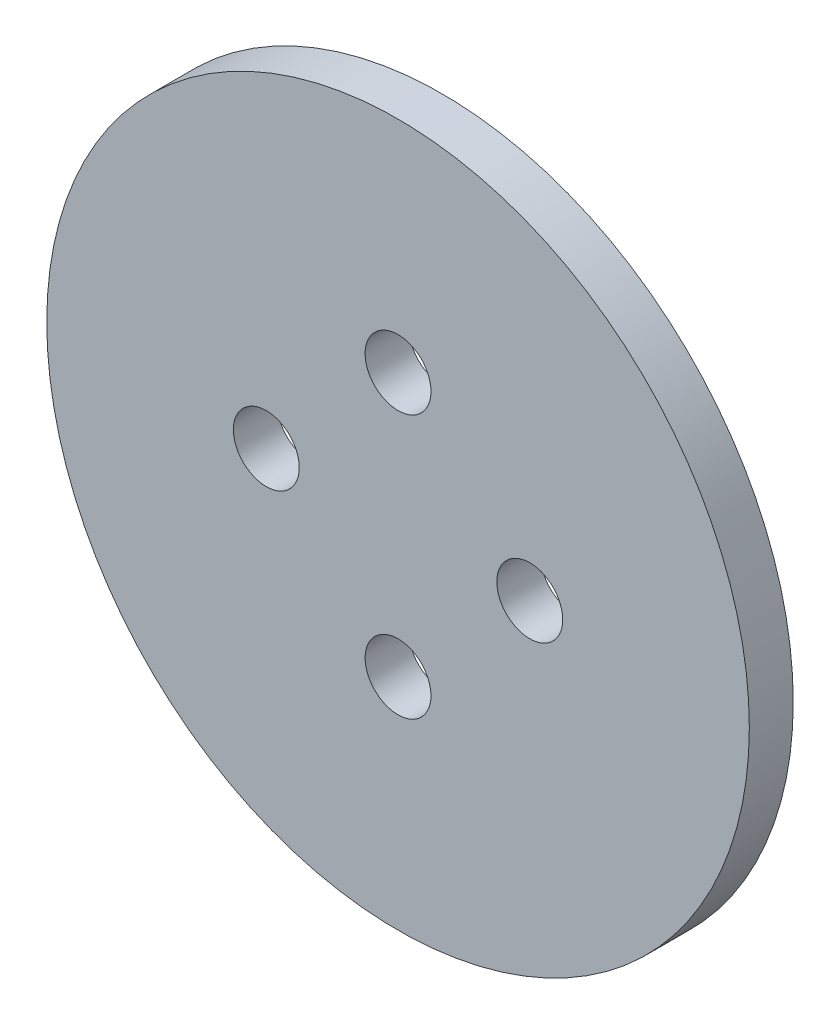
ISO-10303-21;
HEADER;
FILE_DESCRIPTION(('STEP AP214'),'2;1');
FILE_NAME('part.step','',(''),(''),'','','');
FILE_SCHEMA(('AUTOMOTIVE_DESIGN { 1 0 10303 214 1 1 1 1 }'));
ENDSEC;
DATA;
#1=APPLICATION_CONTEXT('core data for automotive mechanical design processes');
#2=APPLICATION_PROTOCOL_DEFINITION('international standard','automotive_design',2000,#1);
#3=PRODUCT_CONTEXT('',#1,'mechanical');
#4=PRODUCT('Part','Part','',(#3));
#5=PRODUCT_RELATED_PRODUCT_CATEGORY('part','',(#4));
#6=PRODUCT_DEFINITION_FORMATION('','',#4);
#7=PRODUCT_DEFINITION_CONTEXT('part definition',#1,'design');
#8=PRODUCT_DEFINITION('design','',#6,#7);
#9=PRODUCT_DEFINITION_SHAPE('','',#8);
#10=(LENGTH_UNIT() NAMED_UNIT(*) SI_UNIT(.MILLI.,.METRE.));
#11=(NAMED_UNIT(*) PLANE_ANGLE_UNIT() SI_UNIT($,.RADIAN.));
#12=(NAMED_UNIT(*) SI_UNIT($,.STERADIAN.) SOLID_ANGLE_UNIT());
#13=UNCERTAINTY_MEASURE_WITH_UNIT(LENGTH_MEASURE(1.E-05),#10,'distance_accuracy_value','');
#14=(GEOMETRIC_REPRESENTATION_CONTEXT(3) GLOBAL_UNCERTAINTY_ASSIGNED_CONTEXT((#13)) GLOBAL_UNIT_ASSIGNED_CONTEXT((#10,
#11,#12)) REPRESENTATION_CONTEXT('',''));
#15=CARTESIAN_POINT('',(0.,0.,0.));
#16=DIRECTION('',(0.,0.,1.));
#17=DIRECTION('',(1.,0.,0.));
#18=AXIS2_PLACEMENT_3D('',#15,#16,#17);
#19=CARTESIAN_POINT('',(0.,0.,3.175));
#20=DIRECTION('',(0.,0.,1.));
#21=DIRECTION('',(1.,0.,0.));
#22=AXIS2_PLACEMENT_3D('',#19,#20,#21);
#23=PLANE('',#22);
#24=CARTESIAN_POINT('',(5.39100612496821E-13,-9.525,3.175));
#25=DIRECTION('',(0.,0.,1.));
#26=DIRECTION('',(1.,0.,0.));
#27=AXIS2_PLACEMENT_3D('',#24,#25,#26);
#28=CIRCLE('',#27,2.38125000000058);
#29=CARTESIAN_POINT('',(2.38125000000112,-9.525,3.175));
#30=VERTEX_POINT('',#29);
#31=EDGE_CURVE('E53',#30,#30,#28,.T.);
#32=ORIENTED_EDGE('',*,*,#31,.F.);
#33=EDGE_LOOP('',(#32));
#34=FACE_BOUND('',#33,.T.);
#35=CARTESIAN_POINT('',(0.,9.525,3.175));
#36=DIRECTION('',(0.,0.,1.));
#37=DIRECTION('',(1.,0.,0.));
#38=AXIS2_PLACEMENT_3D('',#35,#36,#37);
#39=CIRCLE('',#38,2.38125);
#40=CARTESIAN_POINT('',(2.38125,9.525,3.175));
#41=VERTEX_POINT('',#40);
#42=EDGE_CURVE('E42',#41,#41,#39,.T.);
#43=ORIENTED_EDGE('',*,*,#42,.F.);
#44=EDGE_LOOP('',(#43));
#45=FACE_BOUND('',#44,.T.);
#46=CARTESIAN_POINT('',(0.,0.,3.175));
#47=DIRECTION('',(0.,0.,1.));
#48=DIRECTION('',(1.,0.,0.));
#49=AXIS2_PLACEMENT_3D('',#46,#47,#48);
#50=CIRCLE('',#49,25.4);
#51=CARTESIAN_POINT('',(25.4,0.,3.175));
#52=VERTEX_POINT('',#51);
#53=EDGE_CURVE('E10',#52,#52,#50,.T.);
#54=ORIENTED_EDGE('',*,*,#53,.T.);
#55=EDGE_LOOP('',(#54));
#56=FACE_BOUND('',#55,.T.);
#57=CARTESIAN_POINT('',(9.525,0.,3.175));
#58=DIRECTION('',(0.,0.,1.));
#59=DIRECTION('',(1.,0.,0.));
#60=AXIS2_PLACEMENT_3D('',#57,#58,#59);
#61=CIRCLE('',#60,2.38125);
#62=CARTESIAN_POINT('',(11.90625,0.,3.175));
#63=VERTEX_POINT('',#62);
#64=EDGE_CURVE('E47',#63,#63,#61,.T.);
#65=ORIENTED_EDGE('',*,*,#64,.F.);
#66=EDGE_LOOP('',(#65));
#67=FACE_BOUND('',#66,.T.);
#68=CARTESIAN_POINT('',(-9.525,0.,3.175));
#69=DIRECTION('',(0.,0.,1.));
#70=DIRECTION('',(1.,0.,0.));
#71=AXIS2_PLACEMENT_3D('',#68,#69,#70);
#72=CIRCLE('',#71,2.38125);
#73=CARTESIAN_POINT('',(-7.14375,0.,3.175));
#74=VERTEX_POINT('',#73);
#75=EDGE_CURVE('E59',#74,#74,#72,.T.);
#76=ORIENTED_EDGE('',*,*,#75,.F.);
#77=EDGE_LOOP('',(#76));
#78=FACE_BOUND('',#77,.T.);
#79=ADVANCED_FACE('F31',(#34,#45,#56,#67,#78),#23,.T.);
#80=CARTESIAN_POINT('',(0.,0.,0.));
#81=DIRECTION('',(0.,0.,1.));
#82=DIRECTION('',(1.,0.,0.));
#83=AXIS2_PLACEMENT_3D('',#80,#81,#82);
#84=PLANE('',#83);
#85=CARTESIAN_POINT('',(0.,0.,0.));
#86=DIRECTION('',(0.,0.,1.));
#87=DIRECTION('',(1.,0.,0.));
#88=AXIS2_PLACEMENT_3D('',#85,#86,#87);
#89=CIRCLE('',#88,25.4);
#90=CARTESIAN_POINT('',(25.4,0.,0.));
#91=VERTEX_POINT('',#90);
#92=EDGE_CURVE('E35',#91,#91,#89,.T.);
#93=ORIENTED_EDGE('',*,*,#92,.F.);
#94=EDGE_LOOP('',(#93));
#95=FACE_BOUND('',#94,.T.);
#96=CARTESIAN_POINT('',(0.,9.525,0.));
#97=DIRECTION('',(0.,0.,1.));
#98=DIRECTION('',(1.,0.,0.));
#99=AXIS2_PLACEMENT_3D('',#96,#97,#98);
#100=CIRCLE('',#99,2.38125);
#101=CARTESIAN_POINT('',(2.38125,9.525,0.));
#102=VERTEX_POINT('',#101);
#103=EDGE_CURVE('E44',#102,#102,#100,.T.);
#104=ORIENTED_EDGE('',*,*,#103,.T.);
#105=EDGE_LOOP('',(#104));
#106=FACE_BOUND('',#105,.T.);
#107=CARTESIAN_POINT('',(9.525,0.,0.));
#108=DIRECTION('',(0.,0.,1.));
#109=DIRECTION('',(1.,0.,0.));
#110=AXIS2_PLACEMENT_3D('',#107,#108,#109);
#111=CIRCLE('',#110,2.38125);
#112=CARTESIAN_POINT('',(11.90625,0.,0.));
#113=VERTEX_POINT('',#112);
#114=EDGE_CURVE('E50',#113,#113,#111,.T.);
#115=ORIENTED_EDGE('',*,*,#114,.T.);
#116=EDGE_LOOP('',(#115));
#117=FACE_BOUND('',#116,.T.);
#118=CARTESIAN_POINT('',(5.39100612496821E-13,-9.525,0.));
#119=DIRECTION('',(0.,0.,1.));
#120=DIRECTION('',(1.,0.,0.));
#121=AXIS2_PLACEMENT_3D('',#118,#119,#120);
#122=CIRCLE('',#121,2.38125000000058);
#123=CARTESIAN_POINT('',(2.38125000000112,-9.525,0.));
#124=VERTEX_POINT('',#123);
#125=EDGE_CURVE('E56',#124,#124,#122,.T.);
#126=ORIENTED_EDGE('',*,*,#125,.T.);
#127=EDGE_LOOP('',(#126));
#128=FACE_BOUND('',#127,.T.);
#129=CARTESIAN_POINT('',(-9.525,0.,0.));
#130=DIRECTION('',(0.,0.,1.));
#131=DIRECTION('',(1.,0.,0.));
#132=AXIS2_PLACEMENT_3D('',#129,#130,#131);
#133=CIRCLE('',#132,2.38125);
#134=CARTESIAN_POINT('',(-7.14375,0.,0.));
#135=VERTEX_POINT('',#134);
#136=EDGE_CURVE('E62',#135,#135,#133,.T.);
#137=ORIENTED_EDGE('',*,*,#136,.T.);
#138=EDGE_LOOP('',(#137));
#139=FACE_BOUND('',#138,.T.);
#140=ADVANCED_FACE('F72',(#95,#106,#117,#128,#139),#84,.F.);
#141=CARTESIAN_POINT('',(0.,0.,3.175));
#142=DIRECTION('',(0.,0.,-1.));
#143=DIRECTION('',(-1.,0.,0.));
#144=AXIS2_PLACEMENT_3D('',#141,#142,#143);
#145=CYLINDRICAL_SURFACE('',#144,25.4);
#146=ORIENTED_EDGE('',*,*,#53,.F.);
#147=EDGE_LOOP('',(#146));
#148=FACE_BOUND('',#147,.T.);
#149=ORIENTED_EDGE('',*,*,#92,.T.);
#150=EDGE_LOOP('',(#149));
#151=FACE_BOUND('',#150,.T.);
#152=ADVANCED_FACE('F33',(#148,#151),#145,.T.);
#153=CARTESIAN_POINT('',(0.,9.525,3.175));
#154=DIRECTION('',(0.,0.,-1.));
#155=DIRECTION('',(-1.,0.,0.));
#156=AXIS2_PLACEMENT_3D('',#153,#154,#155);
#157=CYLINDRICAL_SURFACE('',#156,2.38125);
#158=ORIENTED_EDGE('',*,*,#42,.T.);
#159=EDGE_LOOP('',(#158));
#160=FACE_BOUND('',#159,.T.);
#161=ORIENTED_EDGE('',*,*,#103,.F.);
#162=EDGE_LOOP('',(#161));
#163=FACE_BOUND('',#162,.T.);
#164=ADVANCED_FACE('F82',(#160,#163),#157,.F.);
#165=CARTESIAN_POINT('',(9.525,0.,3.175));
#166=DIRECTION('',(0.,0.,-1.));
#167=DIRECTION('',(-1.,0.,0.));
#168=AXIS2_PLACEMENT_3D('',#165,#166,#167);
#169=CYLINDRICAL_SURFACE('',#168,2.38125);
#170=ORIENTED_EDGE('',*,*,#64,.T.);
#171=EDGE_LOOP('',(#170));
#172=FACE_BOUND('',#171,.T.);
#173=ORIENTED_EDGE('',*,*,#114,.F.);
#174=EDGE_LOOP('',(#173));
#175=FACE_BOUND('',#174,.T.);
#176=ADVANCED_FACE('F85',(#172,#175),#169,.F.);
#177=CARTESIAN_POINT('',(5.39100612496821E-13,-9.525,3.175));
#178=DIRECTION('',(0.,0.,-1.));
#179=DIRECTION('',(-1.,0.,0.));
#180=AXIS2_PLACEMENT_3D('',#177,#178,#179);
#181=CYLINDRICAL_SURFACE('',#180,2.38125000000058);
#182=ORIENTED_EDGE('',*,*,#31,.T.);
#183=EDGE_LOOP('',(#182));
#184=FACE_BOUND('',#183,.T.);
#185=ORIENTED_EDGE('',*,*,#125,.F.);
#186=EDGE_LOOP('',(#185));
#187=FACE_BOUND('',#186,.T.);
#188=ADVANCED_FACE('F89',(#184,#187),#181,.F.);
#189=CARTESIAN_POINT('',(-9.525,0.,3.175));
#190=DIRECTION('',(0.,0.,-1.));
#191=DIRECTION('',(-1.,0.,0.));
#192=AXIS2_PLACEMENT_3D('',#189,#190,#191);
#193=CYLINDRICAL_SURFACE('',#192,2.38125);
#194=ORIENTED_EDGE('',*,*,#75,.T.);
#195=EDGE_LOOP('',(#194));
#196=FACE_BOUND('',#195,.T.);
#197=ORIENTED_EDGE('',*,*,#136,.F.);
#198=EDGE_LOOP('',(#197));
#199=FACE_BOUND('',#198,.T.);
#200=ADVANCED_FACE('F68',(#196,#199),#193,.F.);
#201=CLOSED_SHELL('',(#79,#140,#152,#164,#176,#188,#200));
#202=MANIFOLD_SOLID_BREP('B2',#201);
#203=ADVANCED_BREP_SHAPE_REPRESENTATION('',(#18,#202),#14);
#204=SHAPE_DEFINITION_REPRESENTATION(#9,#203);
ENDSEC;
END-ISO-10303-21;
